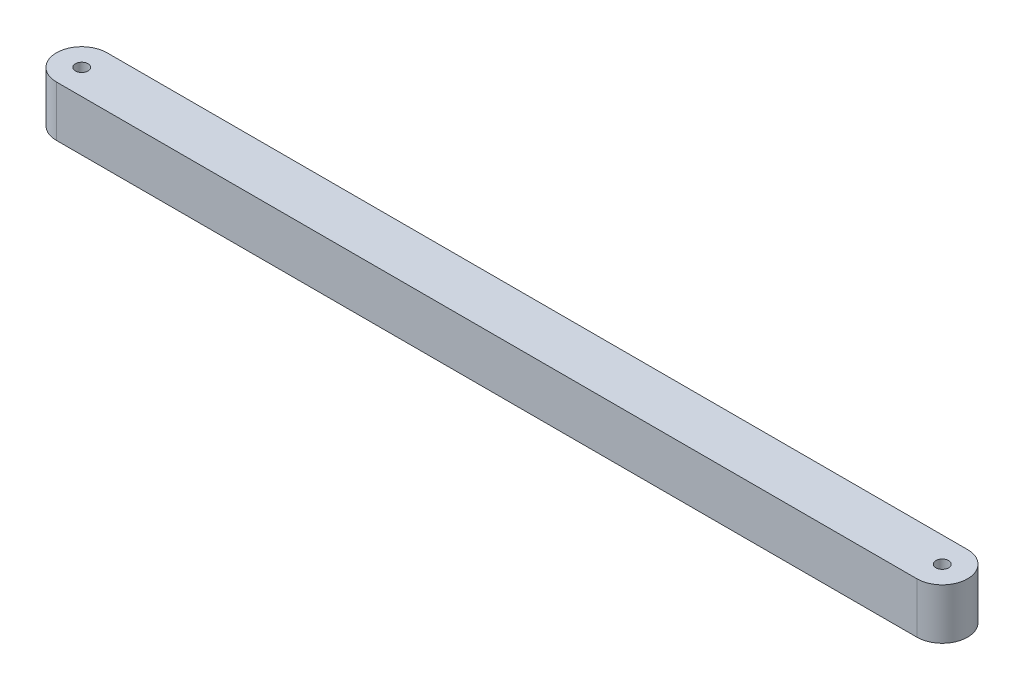
ISO-10303-21;
HEADER;
FILE_DESCRIPTION(('STEP AP214'),'2;1');
FILE_NAME('part.step','',(''),(''),'','','');
FILE_SCHEMA(('AUTOMOTIVE_DESIGN { 1 0 10303 214 1 1 1 1 }'));
ENDSEC;
DATA;
#1=APPLICATION_CONTEXT('core data for automotive mechanical design processes');
#2=APPLICATION_PROTOCOL_DEFINITION('international standard','automotive_design',2000,#1);
#3=PRODUCT_CONTEXT('',#1,'mechanical');
#4=PRODUCT('Part','Part','',(#3));
#5=PRODUCT_RELATED_PRODUCT_CATEGORY('part','',(#4));
#6=PRODUCT_DEFINITION_FORMATION('','',#4);
#7=PRODUCT_DEFINITION_CONTEXT('part definition',#1,'design');
#8=PRODUCT_DEFINITION('design','',#6,#7);
#9=PRODUCT_DEFINITION_SHAPE('','',#8);
#10=(LENGTH_UNIT() NAMED_UNIT(*) SI_UNIT(.MILLI.,.METRE.));
#11=(NAMED_UNIT(*) PLANE_ANGLE_UNIT() SI_UNIT($,.RADIAN.));
#12=(NAMED_UNIT(*) SI_UNIT($,.STERADIAN.) SOLID_ANGLE_UNIT());
#13=UNCERTAINTY_MEASURE_WITH_UNIT(LENGTH_MEASURE(1.E-05),#10,'distance_accuracy_value','');
#14=(GEOMETRIC_REPRESENTATION_CONTEXT(3) GLOBAL_UNCERTAINTY_ASSIGNED_CONTEXT((#13)) GLOBAL_UNIT_ASSIGNED_CONTEXT((#10,
#11,#12)) REPRESENTATION_CONTEXT('',''));
#15=CARTESIAN_POINT('',(0.,0.,0.));
#16=DIRECTION('',(0.,0.,1.));
#17=DIRECTION('',(1.,0.,0.));
#18=AXIS2_PLACEMENT_3D('',#15,#16,#17);
#19=CARTESIAN_POINT('',(-431.8,50.8,0.));
#20=DIRECTION('',(0.,-1.,0.));
#21=DIRECTION('',(0.,0.,-1.));
#22=AXIS2_PLACEMENT_3D('',#19,#20,#21);
#23=CYLINDRICAL_SURFACE('',#22,25.4);
#24=CARTESIAN_POINT('',(-431.8,0.,0.));
#25=DIRECTION('',(0.,1.,0.));
#26=DIRECTION('',(0.,0.,1.));
#27=AXIS2_PLACEMENT_3D('',#24,#25,#26);
#28=CIRCLE('',#27,25.4);
#29=CARTESIAN_POINT('',(-431.8,0.,-25.4));
#30=VERTEX_POINT('',#29);
#31=CARTESIAN_POINT('',(-431.8,0.,25.4));
#32=VERTEX_POINT('',#31);
#33=EDGE_CURVE('E98',#30,#32,#28,.T.);
#34=ORIENTED_EDGE('',*,*,#33,.T.);
#35=DIRECTION('',(0.,-1.,0.));
#36=VECTOR('',#35,1.);
#37=CARTESIAN_POINT('',(-431.8,50.8,25.4));
#38=LINE('',#37,#36);
#39=CARTESIAN_POINT('',(-431.8,50.8,25.4));
#40=VERTEX_POINT('',#39);
#41=EDGE_CURVE('E11',#40,#32,#38,.T.);
#42=ORIENTED_EDGE('',*,*,#41,.F.);
#43=CARTESIAN_POINT('',(-431.8,50.8,0.));
#44=DIRECTION('',(0.,1.,0.));
#45=DIRECTION('',(0.,0.,1.));
#46=AXIS2_PLACEMENT_3D('',#43,#44,#45);
#47=CIRCLE('',#46,25.4);
#48=CARTESIAN_POINT('',(-431.8,50.8,-25.4));
#49=VERTEX_POINT('',#48);
#50=EDGE_CURVE('E84',#49,#40,#47,.T.);
#51=ORIENTED_EDGE('',*,*,#50,.F.);
#52=DIRECTION('',(0.,-1.,0.));
#53=VECTOR('',#52,1.);
#54=CARTESIAN_POINT('',(-431.8,50.8,-25.4));
#55=LINE('',#54,#53);
#56=EDGE_CURVE('E51',#49,#30,#55,.T.);
#57=ORIENTED_EDGE('',*,*,#56,.T.);
#58=EDGE_LOOP('',(#34,#42,#51,#57));
#59=FACE_BOUND('',#58,.T.);
#60=ADVANCED_FACE('F35',(#59),#23,.T.);
#61=CARTESIAN_POINT('',(0.,50.8,25.4));
#62=DIRECTION('',(0.,0.,-1.));
#63=DIRECTION('',(-1.,0.,0.));
#64=AXIS2_PLACEMENT_3D('',#61,#62,#63);
#65=PLANE('',#64);
#66=DIRECTION('',(1.,0.,0.));
#67=VECTOR('',#66,1.);
#68=CARTESIAN_POINT('',(0.,0.,25.4));
#69=LINE('',#68,#67);
#70=CARTESIAN_POINT('',(431.8,0.,25.4));
#71=VERTEX_POINT('',#70);
#72=EDGE_CURVE('E89',#32,#71,#69,.T.);
#73=ORIENTED_EDGE('',*,*,#72,.T.);
#74=DIRECTION('',(0.,-1.,0.));
#75=VECTOR('',#74,1.);
#76=CARTESIAN_POINT('',(431.8,50.8,25.4));
#77=LINE('',#76,#75);
#78=CARTESIAN_POINT('',(431.8,50.8,25.4));
#79=VERTEX_POINT('',#78);
#80=EDGE_CURVE('E43',#79,#71,#77,.T.);
#81=ORIENTED_EDGE('',*,*,#80,.F.);
#82=DIRECTION('',(1.,0.,0.));
#83=VECTOR('',#82,1.);
#84=CARTESIAN_POINT('',(0.,50.8,25.4));
#85=LINE('',#84,#83);
#86=EDGE_CURVE('E76',#40,#79,#85,.T.);
#87=ORIENTED_EDGE('',*,*,#86,.F.);
#88=ORIENTED_EDGE('',*,*,#41,.T.);
#89=EDGE_LOOP('',(#73,#81,#87,#88));
#90=FACE_BOUND('',#89,.T.);
#91=ADVANCED_FACE('F88',(#90),#65,.F.);
#92=CARTESIAN_POINT('',(431.8,50.8,0.));
#93=DIRECTION('',(0.,-1.,0.));
#94=DIRECTION('',(0.,0.,-1.));
#95=AXIS2_PLACEMENT_3D('',#92,#93,#94);
#96=CYLINDRICAL_SURFACE('',#95,25.4);
#97=CARTESIAN_POINT('',(431.8,0.,0.));
#98=DIRECTION('',(0.,1.,0.));
#99=DIRECTION('',(0.,0.,1.));
#100=AXIS2_PLACEMENT_3D('',#97,#98,#99);
#101=CIRCLE('',#100,25.4);
#102=CARTESIAN_POINT('',(431.8,0.,-25.4));
#103=VERTEX_POINT('',#102);
#104=EDGE_CURVE('E102',#103,#71,#101,.F.);
#105=ORIENTED_EDGE('',*,*,#104,.F.);
#106=DIRECTION('',(0.,-1.,0.));
#107=VECTOR('',#106,1.);
#108=CARTESIAN_POINT('',(431.8,50.8,-25.4));
#109=LINE('',#108,#107);
#110=CARTESIAN_POINT('',(431.8,50.8,-25.4));
#111=VERTEX_POINT('',#110);
#112=EDGE_CURVE('E65',#111,#103,#109,.T.);
#113=ORIENTED_EDGE('',*,*,#112,.F.);
#114=CARTESIAN_POINT('',(431.8,50.8,0.));
#115=DIRECTION('',(0.,1.,0.));
#116=DIRECTION('',(0.,0.,1.));
#117=AXIS2_PLACEMENT_3D('',#114,#115,#116);
#118=CIRCLE('',#117,25.4);
#119=EDGE_CURVE('E83',#111,#79,#118,.F.);
#120=ORIENTED_EDGE('',*,*,#119,.T.);
#121=ORIENTED_EDGE('',*,*,#80,.T.);
#122=EDGE_LOOP('',(#105,#113,#120,#121));
#123=FACE_BOUND('',#122,.T.);
#124=ADVANCED_FACE('F92',(#123),#96,.T.);
#125=CARTESIAN_POINT('',(0.,50.8,-25.4));
#126=DIRECTION('',(0.,0.,-1.));
#127=DIRECTION('',(-1.,0.,0.));
#128=AXIS2_PLACEMENT_3D('',#125,#126,#127);
#129=PLANE('',#128);
#130=DIRECTION('',(1.,0.,0.));
#131=VECTOR('',#130,1.);
#132=CARTESIAN_POINT('',(0.,0.,-25.4));
#133=LINE('',#132,#131);
#134=EDGE_CURVE('E104',#30,#103,#133,.T.);
#135=ORIENTED_EDGE('',*,*,#134,.F.);
#136=ORIENTED_EDGE('',*,*,#56,.F.);
#137=DIRECTION('',(1.,0.,0.));
#138=VECTOR('',#137,1.);
#139=CARTESIAN_POINT('',(0.,50.8,-25.4));
#140=LINE('',#139,#138);
#141=EDGE_CURVE('E93',#49,#111,#140,.T.);
#142=ORIENTED_EDGE('',*,*,#141,.T.);
#143=ORIENTED_EDGE('',*,*,#112,.T.);
#144=EDGE_LOOP('',(#135,#136,#142,#143));
#145=FACE_BOUND('',#144,.T.);
#146=ADVANCED_FACE('F127',(#145),#129,.T.);
#147=CARTESIAN_POINT('',(0.,50.8,0.));
#148=DIRECTION('',(0.,1.,0.));
#149=DIRECTION('',(0.,0.,1.));
#150=AXIS2_PLACEMENT_3D('',#147,#148,#149);
#151=PLANE('',#150);
#152=CARTESIAN_POINT('',(431.8,50.8,0.));
#153=DIRECTION('',(0.,1.,0.));
#154=DIRECTION('',(0.,0.,1.));
#155=AXIS2_PLACEMENT_3D('',#152,#153,#154);
#156=CIRCLE('',#155,6.35000000000002);
#157=CARTESIAN_POINT('',(431.8,50.8,6.35000000000002));
#158=VERTEX_POINT('',#157);
#159=EDGE_CURVE('E118',#158,#158,#156,.T.);
#160=ORIENTED_EDGE('',*,*,#159,.F.);
#161=EDGE_LOOP('',(#160));
#162=FACE_BOUND('',#161,.T.);
#163=CARTESIAN_POINT('',(-431.8,50.8,0.));
#164=DIRECTION('',(0.,1.,0.));
#165=DIRECTION('',(0.,0.,1.));
#166=AXIS2_PLACEMENT_3D('',#163,#164,#165);
#167=CIRCLE('',#166,6.35000000000002);
#168=CARTESIAN_POINT('',(-431.8,50.8,6.35000000000002));
#169=VERTEX_POINT('',#168);
#170=EDGE_CURVE('E112',#169,#169,#167,.T.);
#171=ORIENTED_EDGE('',*,*,#170,.F.);
#172=EDGE_LOOP('',(#171));
#173=FACE_BOUND('',#172,.T.);
#174=ORIENTED_EDGE('',*,*,#50,.T.);
#175=ORIENTED_EDGE('',*,*,#86,.T.);
#176=ORIENTED_EDGE('',*,*,#119,.F.);
#177=ORIENTED_EDGE('',*,*,#141,.F.);
#178=EDGE_LOOP('',(#174,#175,#176,#177));
#179=FACE_BOUND('',#178,.T.);
#180=ADVANCED_FACE('F80',(#162,#173,#179),#151,.T.);
#181=CARTESIAN_POINT('',(0.,0.,0.));
#182=DIRECTION('',(0.,1.,0.));
#183=DIRECTION('',(0.,0.,1.));
#184=AXIS2_PLACEMENT_3D('',#181,#182,#183);
#185=PLANE('',#184);
#186=CARTESIAN_POINT('',(431.8,0.,0.));
#187=DIRECTION('',(0.,1.,0.));
#188=DIRECTION('',(0.,0.,1.));
#189=AXIS2_PLACEMENT_3D('',#186,#187,#188);
#190=CIRCLE('',#189,6.34999999999997);
#191=CARTESIAN_POINT('',(431.8,0.,6.34999999999997));
#192=VERTEX_POINT('',#191);
#193=EDGE_CURVE('E115',#192,#192,#190,.T.);
#194=ORIENTED_EDGE('',*,*,#193,.T.);
#195=EDGE_LOOP('',(#194));
#196=FACE_BOUND('',#195,.T.);
#197=CARTESIAN_POINT('',(-431.8,0.,0.));
#198=DIRECTION('',(0.,1.,0.));
#199=DIRECTION('',(0.,0.,1.));
#200=AXIS2_PLACEMENT_3D('',#197,#198,#199);
#201=CIRCLE('',#200,6.34999999999997);
#202=CARTESIAN_POINT('',(-431.8,0.,6.34999999999997));
#203=VERTEX_POINT('',#202);
#204=EDGE_CURVE('E100',#203,#203,#201,.T.);
#205=ORIENTED_EDGE('',*,*,#204,.T.);
#206=EDGE_LOOP('',(#205));
#207=FACE_BOUND('',#206,.T.);
#208=ORIENTED_EDGE('',*,*,#33,.F.);
#209=ORIENTED_EDGE('',*,*,#134,.T.);
#210=ORIENTED_EDGE('',*,*,#104,.T.);
#211=ORIENTED_EDGE('',*,*,#72,.F.);
#212=EDGE_LOOP('',(#208,#209,#210,#211));
#213=FACE_BOUND('',#212,.T.);
#214=ADVANCED_FACE('F126',(#196,#207,#213),#185,.F.);
#215=CARTESIAN_POINT('',(-431.8,50.8,0.));
#216=DIRECTION('',(0.,1.,0.));
#217=DIRECTION('',(0.,0.,1.));
#218=AXIS2_PLACEMENT_3D('',#215,#216,#217);
#219=CYLINDRICAL_SURFACE('',#218,6.34999999999999);
#220=ORIENTED_EDGE('',*,*,#204,.F.);
#221=EDGE_LOOP('',(#220));
#222=FACE_BOUND('',#221,.T.);
#223=ORIENTED_EDGE('',*,*,#170,.T.);
#224=EDGE_LOOP('',(#223));
#225=FACE_BOUND('',#224,.T.);
#226=ADVANCED_FACE('F131',(#222,#225),#219,.F.);
#227=CARTESIAN_POINT('',(431.8,50.8,0.));
#228=DIRECTION('',(0.,1.,0.));
#229=DIRECTION('',(0.,0.,1.));
#230=AXIS2_PLACEMENT_3D('',#227,#228,#229);
#231=CYLINDRICAL_SURFACE('',#230,6.34999999999999);
#232=ORIENTED_EDGE('',*,*,#193,.F.);
#233=EDGE_LOOP('',(#232));
#234=FACE_BOUND('',#233,.T.);
#235=ORIENTED_EDGE('',*,*,#159,.T.);
#236=EDGE_LOOP('',(#235));
#237=FACE_BOUND('',#236,.T.);
#238=ADVANCED_FACE('F122',(#234,#237),#231,.F.);
#239=CLOSED_SHELL('',(#60,#91,#124,#146,#180,#214,#226,#238));
#240=MANIFOLD_SOLID_BREP('B2',#239);
#241=ADVANCED_BREP_SHAPE_REPRESENTATION('',(#18,#240),#14);
#242=SHAPE_DEFINITION_REPRESENTATION(#9,#241);
ENDSEC;
END-ISO-10303-21;
